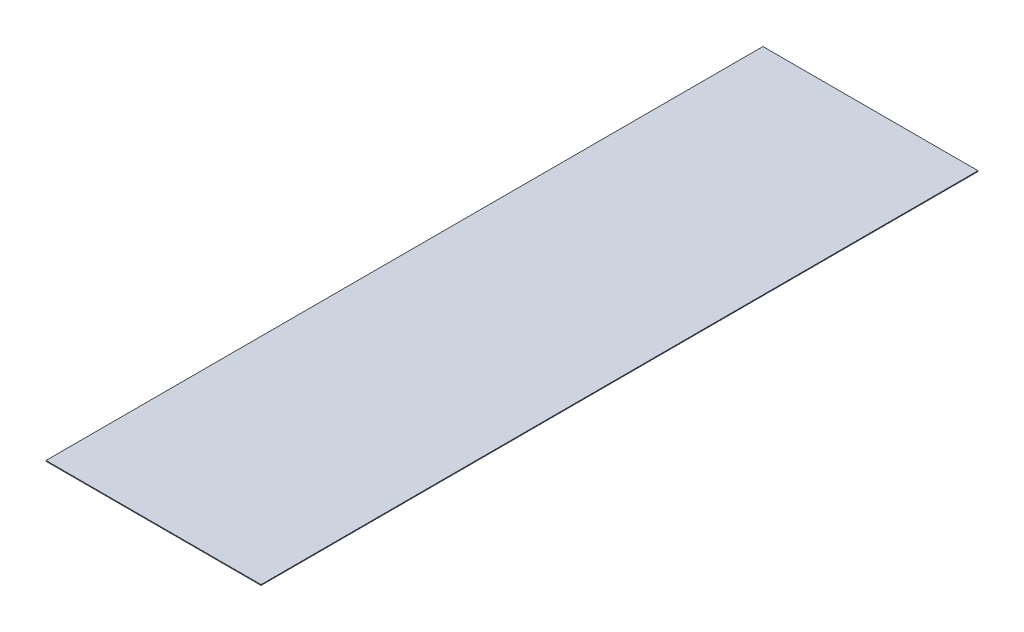
ISO-10303-21;
HEADER;
FILE_DESCRIPTION(('STEP AP214'),'2;1');
FILE_NAME('part.step','',(''),(''),'','','');
FILE_SCHEMA(('AUTOMOTIVE_DESIGN { 1 0 10303 214 1 1 1 1 }'));
ENDSEC;
DATA;
#1=APPLICATION_CONTEXT('core data for automotive mechanical design processes');
#2=APPLICATION_PROTOCOL_DEFINITION('international standard','automotive_design',2000,#1);
#3=PRODUCT_CONTEXT('',#1,'mechanical');
#4=PRODUCT('Part','Part','',(#3));
#5=PRODUCT_RELATED_PRODUCT_CATEGORY('part','',(#4));
#6=PRODUCT_DEFINITION_FORMATION('','',#4);
#7=PRODUCT_DEFINITION_CONTEXT('part definition',#1,'design');
#8=PRODUCT_DEFINITION('design','',#6,#7);
#9=PRODUCT_DEFINITION_SHAPE('','',#8);
#10=(LENGTH_UNIT() NAMED_UNIT(*) SI_UNIT(.MILLI.,.METRE.));
#11=(NAMED_UNIT(*) PLANE_ANGLE_UNIT() SI_UNIT($,.RADIAN.));
#12=(NAMED_UNIT(*) SI_UNIT($,.STERADIAN.) SOLID_ANGLE_UNIT());
#13=UNCERTAINTY_MEASURE_WITH_UNIT(LENGTH_MEASURE(1.E-05),#10,'distance_accuracy_value','');
#14=(GEOMETRIC_REPRESENTATION_CONTEXT(3) GLOBAL_UNCERTAINTY_ASSIGNED_CONTEXT((#13)) GLOBAL_UNIT_ASSIGNED_CONTEXT((#10,
#11,#12)) REPRESENTATION_CONTEXT('',''));
#15=CARTESIAN_POINT('',(0.,0.,0.));
#16=DIRECTION('',(0.,0.,1.));
#17=DIRECTION('',(1.,0.,0.));
#18=AXIS2_PLACEMENT_3D('',#15,#16,#17);
#19=CARTESIAN_POINT('',(457.2,3.2,1524.));
#20=DIRECTION('',(-1.,0.,0.));
#21=DIRECTION('',(0.,0.,1.));
#22=AXIS2_PLACEMENT_3D('',#19,#20,#21);
#23=PLANE('',#22);
#24=DIRECTION('',(0.,0.,-1.));
#25=VECTOR('',#24,1.);
#26=CARTESIAN_POINT('',(457.2,0.,1524.));
#27=LINE('',#26,#25);
#28=CARTESIAN_POINT('',(457.2,0.,1524.));
#29=VERTEX_POINT('',#28);
#30=CARTESIAN_POINT('',(457.2,0.,-1524.));
#31=VERTEX_POINT('',#30);
#32=EDGE_CURVE('E96',#29,#31,#27,.T.);
#33=ORIENTED_EDGE('',*,*,#32,.T.);
#34=DIRECTION('',(0.,-1.,0.));
#35=VECTOR('',#34,1.);
#36=CARTESIAN_POINT('',(457.2,3.2,-1524.));
#37=LINE('',#36,#35);
#38=CARTESIAN_POINT('',(457.2,3.2,-1524.));
#39=VERTEX_POINT('',#38);
#40=EDGE_CURVE('E11',#39,#31,#37,.T.);
#41=ORIENTED_EDGE('',*,*,#40,.F.);
#42=DIRECTION('',(0.,0.,-1.));
#43=VECTOR('',#42,1.);
#44=CARTESIAN_POINT('',(457.2,3.2,1524.));
#45=LINE('',#44,#43);
#46=CARTESIAN_POINT('',(457.2,3.2,1524.));
#47=VERTEX_POINT('',#46);
#48=EDGE_CURVE('E84',#47,#39,#45,.T.);
#49=ORIENTED_EDGE('',*,*,#48,.F.);
#50=DIRECTION('',(0.,-1.,0.));
#51=VECTOR('',#50,1.);
#52=CARTESIAN_POINT('',(457.2,3.2,1524.));
#53=LINE('',#52,#51);
#54=EDGE_CURVE('E92',#47,#29,#53,.T.);
#55=ORIENTED_EDGE('',*,*,#54,.T.);
#56=EDGE_LOOP('',(#33,#41,#49,#55));
#57=FACE_BOUND('',#56,.T.);
#58=ADVANCED_FACE('F33',(#57),#23,.F.);
#59=CARTESIAN_POINT('',(-457.2,3.2,-1524.));
#60=DIRECTION('',(0.,0.,1.));
#61=DIRECTION('',(1.,0.,0.));
#62=AXIS2_PLACEMENT_3D('',#59,#60,#61);
#63=PLANE('',#62);
#64=DIRECTION('',(-1.,0.,0.));
#65=VECTOR('',#64,1.);
#66=CARTESIAN_POINT('',(-457.2,0.,-1524.));
#67=LINE('',#66,#65);
#68=CARTESIAN_POINT('',(-457.2,0.,-1524.));
#69=VERTEX_POINT('',#68);
#70=EDGE_CURVE('E88',#31,#69,#67,.T.);
#71=ORIENTED_EDGE('',*,*,#70,.T.);
#72=DIRECTION('',(0.,-1.,0.));
#73=VECTOR('',#72,1.);
#74=CARTESIAN_POINT('',(-457.2,3.2,-1524.));
#75=LINE('',#74,#73);
#76=CARTESIAN_POINT('',(-457.2,3.2,-1524.));
#77=VERTEX_POINT('',#76);
#78=EDGE_CURVE('E41',#77,#69,#75,.T.);
#79=ORIENTED_EDGE('',*,*,#78,.F.);
#80=DIRECTION('',(-1.,0.,0.));
#81=VECTOR('',#80,1.);
#82=CARTESIAN_POINT('',(-457.2,3.2,-1524.));
#83=LINE('',#82,#81);
#84=EDGE_CURVE('E79',#39,#77,#83,.T.);
#85=ORIENTED_EDGE('',*,*,#84,.F.);
#86=ORIENTED_EDGE('',*,*,#40,.T.);
#87=EDGE_LOOP('',(#71,#79,#85,#86));
#88=FACE_BOUND('',#87,.T.);
#89=ADVANCED_FACE('F87',(#88),#63,.F.);
#90=CARTESIAN_POINT('',(-457.2,3.2,1524.));
#91=DIRECTION('',(1.,0.,0.));
#92=DIRECTION('',(0.,0.,-1.));
#93=AXIS2_PLACEMENT_3D('',#90,#91,#92);
#94=PLANE('',#93);
#95=DIRECTION('',(0.,0.,1.));
#96=VECTOR('',#95,1.);
#97=CARTESIAN_POINT('',(-457.2,0.,1524.));
#98=LINE('',#97,#96);
#99=CARTESIAN_POINT('',(-457.2,0.,1524.));
#100=VERTEX_POINT('',#99);
#101=EDGE_CURVE('E66',#69,#100,#98,.T.);
#102=ORIENTED_EDGE('',*,*,#101,.T.);
#103=DIRECTION('',(0.,-1.,0.));
#104=VECTOR('',#103,1.);
#105=CARTESIAN_POINT('',(-457.2,3.2,1524.));
#106=LINE('',#105,#104);
#107=CARTESIAN_POINT('',(-457.2,3.2,1524.));
#108=VERTEX_POINT('',#107);
#109=EDGE_CURVE('E89',#108,#100,#106,.T.);
#110=ORIENTED_EDGE('',*,*,#109,.F.);
#111=DIRECTION('',(0.,0.,1.));
#112=VECTOR('',#111,1.);
#113=CARTESIAN_POINT('',(-457.2,3.2,1524.));
#114=LINE('',#113,#112);
#115=EDGE_CURVE('E82',#77,#108,#114,.T.);
#116=ORIENTED_EDGE('',*,*,#115,.F.);
#117=ORIENTED_EDGE('',*,*,#78,.T.);
#118=EDGE_LOOP('',(#102,#110,#116,#117));
#119=FACE_BOUND('',#118,.T.);
#120=ADVANCED_FACE('F90',(#119),#94,.F.);
#121=CARTESIAN_POINT('',(-457.2,3.2,1524.));
#122=DIRECTION('',(0.,0.,-1.));
#123=DIRECTION('',(-1.,0.,0.));
#124=AXIS2_PLACEMENT_3D('',#121,#122,#123);
#125=PLANE('',#124);
#126=DIRECTION('',(1.,0.,0.));
#127=VECTOR('',#126,1.);
#128=CARTESIAN_POINT('',(-457.2,0.,1524.));
#129=LINE('',#128,#127);
#130=EDGE_CURVE('E72',#100,#29,#129,.T.);
#131=ORIENTED_EDGE('',*,*,#130,.T.);
#132=ORIENTED_EDGE('',*,*,#54,.F.);
#133=DIRECTION('',(1.,0.,0.));
#134=VECTOR('',#133,1.);
#135=CARTESIAN_POINT('',(-457.2,3.2,1524.));
#136=LINE('',#135,#134);
#137=EDGE_CURVE('E49',#108,#47,#136,.T.);
#138=ORIENTED_EDGE('',*,*,#137,.F.);
#139=ORIENTED_EDGE('',*,*,#109,.T.);
#140=EDGE_LOOP('',(#131,#132,#138,#139));
#141=FACE_BOUND('',#140,.T.);
#142=ADVANCED_FACE('F103',(#141),#125,.F.);
#143=CARTESIAN_POINT('',(0.,3.2,0.));
#144=DIRECTION('',(0.,-1.,0.));
#145=DIRECTION('',(0.,0.,-1.));
#146=AXIS2_PLACEMENT_3D('',#143,#144,#145);
#147=PLANE('',#146);
#148=ORIENTED_EDGE('',*,*,#48,.T.);
#149=ORIENTED_EDGE('',*,*,#84,.T.);
#150=ORIENTED_EDGE('',*,*,#115,.T.);
#151=ORIENTED_EDGE('',*,*,#137,.T.);
#152=EDGE_LOOP('',(#148,#149,#150,#151));
#153=FACE_BOUND('',#152,.T.);
#154=ADVANCED_FACE('F80',(#153),#147,.F.);
#155=CARTESIAN_POINT('',(0.,0.,0.));
#156=DIRECTION('',(0.,-1.,0.));
#157=DIRECTION('',(0.,0.,-1.));
#158=AXIS2_PLACEMENT_3D('',#155,#156,#157);
#159=PLANE('',#158);
#160=ORIENTED_EDGE('',*,*,#32,.F.);
#161=ORIENTED_EDGE('',*,*,#130,.F.);
#162=ORIENTED_EDGE('',*,*,#101,.F.);
#163=ORIENTED_EDGE('',*,*,#70,.F.);
#164=EDGE_LOOP('',(#160,#161,#162,#163));
#165=FACE_BOUND('',#164,.T.);
#166=ADVANCED_FACE('F106',(#165),#159,.T.);
#167=CLOSED_SHELL('',(#58,#89,#120,#142,#154,#166));
#168=MANIFOLD_SOLID_BREP('B2',#167);
#169=ADVANCED_BREP_SHAPE_REPRESENTATION('',(#18,#168),#14);
#170=SHAPE_DEFINITION_REPRESENTATION(#9,#169);
ENDSEC;
END-ISO-10303-21;
